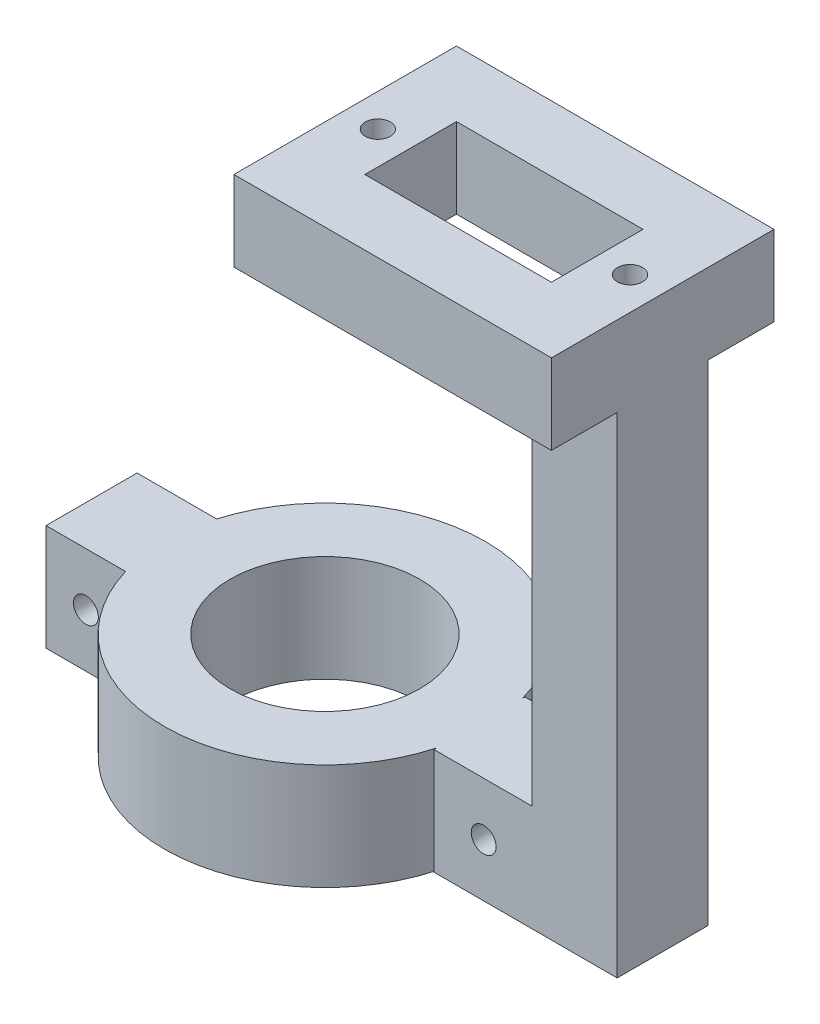
ISO-10303-21;
HEADER;
FILE_DESCRIPTION(('STEP AP214'),'2;1');
FILE_NAME('part.step','',(''),(''),'','','');
FILE_SCHEMA(('AUTOMOTIVE_DESIGN { 1 0 10303 214 1 1 1 1 }'));
ENDSEC;
DATA;
#1=APPLICATION_CONTEXT('core data for automotive mechanical design processes');
#2=APPLICATION_PROTOCOL_DEFINITION('international standard','automotive_design',2000,#1);
#3=PRODUCT_CONTEXT('',#1,'mechanical');
#4=PRODUCT('Part','Part','',(#3));
#5=PRODUCT_RELATED_PRODUCT_CATEGORY('part','',(#4));
#6=PRODUCT_DEFINITION_FORMATION('','',#4);
#7=PRODUCT_DEFINITION_CONTEXT('part definition',#1,'design');
#8=PRODUCT_DEFINITION('design','',#6,#7);
#9=PRODUCT_DEFINITION_SHAPE('','',#8);
#10=(LENGTH_UNIT() NAMED_UNIT(*) SI_UNIT(.MILLI.,.METRE.));
#11=(NAMED_UNIT(*) PLANE_ANGLE_UNIT() SI_UNIT($,.RADIAN.));
#12=(NAMED_UNIT(*) SI_UNIT($,.STERADIAN.) SOLID_ANGLE_UNIT());
#13=UNCERTAINTY_MEASURE_WITH_UNIT(LENGTH_MEASURE(1.E-05),#10,'distance_accuracy_value','');
#14=(GEOMETRIC_REPRESENTATION_CONTEXT(3) GLOBAL_UNCERTAINTY_ASSIGNED_CONTEXT((#13)) GLOBAL_UNIT_ASSIGNED_CONTEXT((#10,
#11,#12)) REPRESENTATION_CONTEXT('',''));
#15=CARTESIAN_POINT('',(0.,0.,0.));
#16=DIRECTION('',(0.,0.,1.));
#17=DIRECTION('',(1.,0.,0.));
#18=AXIS2_PLACEMENT_3D('',#15,#16,#17);
#19=CARTESIAN_POINT('',(-27.351479578733,-58.59,0.));
#20=DIRECTION('',(0.,-1.,0.));
#21=DIRECTION('',(0.,0.,-1.));
#22=AXIS2_PLACEMENT_3D('',#19,#20,#21);
#23=CYLINDRICAL_SURFACE('',#22,24.5);
#24=DIRECTION('',(0.,-1.,0.));
#25=VECTOR('',#24,1.);
#26=CARTESIAN_POINT('',(-50.8435628196889,-58.59,-6.95500000000001));
#27=LINE('',#26,#25);
#28=CARTESIAN_POINT('',(-50.8435628196889,-58.59,-6.95500000000001));
#29=VERTEX_POINT('',#28);
#30=CARTESIAN_POINT('',(-50.8435628196889,-74.82,-6.95500000000001));
#31=VERTEX_POINT('',#30);
#32=EDGE_CURVE('E12',#29,#31,#27,.T.);
#33=ORIENTED_EDGE('',*,*,#32,.F.);
#34=CARTESIAN_POINT('',(-27.351479578733,-58.59,0.));
#35=DIRECTION('',(0.,-1.,0.));
#36=DIRECTION('',(1.,0.,0.));
#37=AXIS2_PLACEMENT_3D('',#34,#35,#36);
#38=CIRCLE('',#37,24.5);
#39=CARTESIAN_POINT('',(-3.74499999999999,-58.59,-6.55622771865516));
#40=VERTEX_POINT('',#39);
#41=EDGE_CURVE('E216',#29,#40,#38,.T.);
#42=ORIENTED_EDGE('',*,*,#41,.T.);
#43=DIRECTION('',(0.,-1.,0.));
#44=VECTOR('',#43,1.);
#45=CARTESIAN_POINT('',(-3.745,-58.59,-6.55622771865516));
#46=LINE('',#45,#44);
#47=CARTESIAN_POINT('',(-3.74499999999999,-74.82,-6.55622771865516));
#48=VERTEX_POINT('',#47);
#49=EDGE_CURVE('E386',#48,#40,#46,.F.);
#50=ORIENTED_EDGE('',*,*,#49,.F.);
#51=CARTESIAN_POINT('',(-27.351479578733,-74.82,0.));
#52=DIRECTION('',(0.,-1.,0.));
#53=DIRECTION('',(1.,0.,0.));
#54=AXIS2_PLACEMENT_3D('',#51,#52,#53);
#55=CIRCLE('',#54,24.5);
#56=EDGE_CURVE('E81',#31,#48,#55,.T.);
#57=ORIENTED_EDGE('',*,*,#56,.F.);
#58=EDGE_LOOP('',(#33,#42,#50,#57));
#59=FACE_BOUND('',#58,.T.);
#60=ADVANCED_FACE('F65',(#59),#23,.T.);
#61=CARTESIAN_POINT('',(-3.745,0.,0.));
#62=DIRECTION('',(1.,0.,0.));
#63=DIRECTION('',(0.,0.,-1.));
#64=AXIS2_PLACEMENT_3D('',#61,#62,#63);
#65=PLANE('',#64);
#66=DIRECTION('',(0.,0.,-1.));
#67=VECTOR('',#66,1.);
#68=CARTESIAN_POINT('',(-3.74499999999999,-58.59,-6.95500000000001));
#69=LINE('',#68,#67);
#70=CARTESIAN_POINT('',(-3.745,-58.59,6.95499999999999));
#71=VERTEX_POINT('',#70);
#72=CARTESIAN_POINT('',(-3.745,-58.59,6.55622771865517));
#73=VERTEX_POINT('',#72);
#74=EDGE_CURVE('E272',#71,#73,#69,.T.);
#75=ORIENTED_EDGE('',*,*,#74,.T.);
#76=DIRECTION('',(0.,-1.,0.));
#77=VECTOR('',#76,1.);
#78=CARTESIAN_POINT('',(-3.745,-58.59,6.55622771865518));
#79=LINE('',#78,#77);
#80=CARTESIAN_POINT('',(-3.745,-74.82,6.55622771865518));
#81=VERTEX_POINT('',#80);
#82=EDGE_CURVE('E389',#73,#81,#79,.T.);
#83=ORIENTED_EDGE('',*,*,#82,.T.);
#84=DIRECTION('',(0.,0.,1.));
#85=VECTOR('',#84,1.);
#86=CARTESIAN_POINT('',(-3.74499999999999,-74.82,-6.95500000000001));
#87=LINE('',#86,#85);
#88=CARTESIAN_POINT('',(-3.745,-74.82,6.95499999999999));
#89=VERTEX_POINT('',#88);
#90=EDGE_CURVE('E265',#81,#89,#87,.T.);
#91=ORIENTED_EDGE('',*,*,#90,.T.);
#92=DIRECTION('',(0.,1.,0.));
#93=VECTOR('',#92,1.);
#94=CARTESIAN_POINT('',(-3.745,-74.82,6.95499999999999));
#95=LINE('',#94,#93);
#96=EDGE_CURVE('E269',#89,#71,#95,.T.);
#97=ORIENTED_EDGE('',*,*,#96,.T.);
#98=EDGE_LOOP('',(#75,#83,#91,#97));
#99=FACE_BOUND('',#98,.T.);
#100=ADVANCED_FACE('F401',(#99),#65,.F.);
#101=CARTESIAN_POINT('',(11.255,-74.82,6.955));
#102=DIRECTION('',(1.,0.,0.));
#103=DIRECTION('',(0.,0.,-1.));
#104=AXIS2_PLACEMENT_3D('',#101,#102,#103);
#105=PLANE('',#104);
#106=DIRECTION('',(0.,0.,-1.));
#107=VECTOR('',#106,1.);
#108=CARTESIAN_POINT('',(11.255,-58.59,-6.955));
#109=LINE('',#108,#107);
#110=CARTESIAN_POINT('',(11.255,-58.59,6.955));
#111=VERTEX_POINT('',#110);
#112=CARTESIAN_POINT('',(11.255,-58.59,-6.955));
#113=VERTEX_POINT('',#112);
#114=EDGE_CURVE('E259',#111,#113,#109,.T.);
#115=ORIENTED_EDGE('',*,*,#114,.F.);
#116=DIRECTION('',(0.,1.,0.));
#117=VECTOR('',#116,1.);
#118=CARTESIAN_POINT('',(11.255,-74.82,6.955));
#119=LINE('',#118,#117);
#120=CARTESIAN_POINT('',(11.255,0.,6.955));
#121=VERTEX_POINT('',#120);
#122=EDGE_CURVE('E306',#111,#121,#119,.T.);
#123=ORIENTED_EDGE('',*,*,#122,.T.);
#124=DIRECTION('',(0.,0.,-1.));
#125=VECTOR('',#124,1.);
#126=CARTESIAN_POINT('',(11.255,0.,6.955));
#127=LINE('',#126,#125);
#128=CARTESIAN_POINT('',(11.255,0.,-6.955));
#129=VERTEX_POINT('',#128);
#130=EDGE_CURVE('E296',#121,#129,#127,.T.);
#131=ORIENTED_EDGE('',*,*,#130,.T.);
#132=DIRECTION('',(0.,1.,0.));
#133=VECTOR('',#132,1.);
#134=CARTESIAN_POINT('',(11.255,-74.82,-6.955));
#135=LINE('',#134,#133);
#136=EDGE_CURVE('E304',#113,#129,#135,.T.);
#137=ORIENTED_EDGE('',*,*,#136,.F.);
#138=EDGE_LOOP('',(#115,#123,#131,#137));
#139=FACE_BOUND('',#138,.T.);
#140=ADVANCED_FACE('F442',(#139),#105,.F.);
#141=CARTESIAN_POINT('',(0.,0.,0.));
#142=DIRECTION('',(0.,1.,0.));
#143=DIRECTION('',(0.,0.,1.));
#144=AXIS2_PLACEMENT_3D('',#141,#142,#143);
#145=PLANE('',#144);
#146=CARTESIAN_POINT('',(-19.2550000000077,0.,0.));
#147=DIRECTION('',(0.,1.,0.));
#148=DIRECTION('',(0.,0.,1.));
#149=AXIS2_PLACEMENT_3D('',#146,#147,#148);
#150=CIRCLE('',#149,1.91);
#151=CARTESIAN_POINT('',(-19.2550000000077,0.,1.91));
#152=VERTEX_POINT('',#151);
#153=EDGE_CURVE('E318',#152,#152,#150,.T.);
#154=ORIENTED_EDGE('',*,*,#153,.T.);
#155=EDGE_LOOP('',(#154));
#156=FACE_BOUND('',#155,.T.);
#157=DIRECTION('',(1.,0.,0.));
#158=VECTOR('',#157,1.);
#159=CARTESIAN_POINT('',(11.255,0.,-6.955));
#160=LINE('',#159,#158);
#161=CARTESIAN_POINT('',(14.255,0.,-6.955));
#162=VERTEX_POINT('',#161);
#163=CARTESIAN_POINT('',(24.255,0.,-6.955));
#164=VERTEX_POINT('',#163);
#165=EDGE_CURVE('E301',#162,#164,#160,.T.);
#166=ORIENTED_EDGE('',*,*,#165,.F.);
#167=DIRECTION('',(0.,0.,-1.));
#168=VECTOR('',#167,1.);
#169=CARTESIAN_POINT('',(14.255,0.,-7.));
#170=LINE('',#169,#168);
#171=CARTESIAN_POINT('',(14.255,0.,-7.));
#172=VERTEX_POINT('',#171);
#173=EDGE_CURVE('E321',#162,#172,#170,.T.);
#174=ORIENTED_EDGE('',*,*,#173,.T.);
#175=DIRECTION('',(-1.,0.,0.));
#176=VECTOR('',#175,1.);
#177=CARTESIAN_POINT('',(-14.255,0.,-7.));
#178=LINE('',#177,#176);
#179=CARTESIAN_POINT('',(-14.255,0.,-7.));
#180=VERTEX_POINT('',#179);
#181=EDGE_CURVE('E337',#172,#180,#178,.T.);
#182=ORIENTED_EDGE('',*,*,#181,.T.);
#183=DIRECTION('',(0.,0.,1.));
#184=VECTOR('',#183,1.);
#185=CARTESIAN_POINT('',(-14.255,0.,-7.));
#186=LINE('',#185,#184);
#187=CARTESIAN_POINT('',(-14.255,0.,7.));
#188=VERTEX_POINT('',#187);
#189=EDGE_CURVE('E341',#180,#188,#186,.T.);
#190=ORIENTED_EDGE('',*,*,#189,.T.);
#191=DIRECTION('',(1.,0.,0.));
#192=VECTOR('',#191,1.);
#193=CARTESIAN_POINT('',(-14.255,0.,7.));
#194=LINE('',#193,#192);
#195=CARTESIAN_POINT('',(14.255,0.,7.));
#196=VERTEX_POINT('',#195);
#197=EDGE_CURVE('E327',#188,#196,#194,.T.);
#198=ORIENTED_EDGE('',*,*,#197,.T.);
#199=CARTESIAN_POINT('',(14.255,0.,6.955));
#200=VERTEX_POINT('',#199);
#201=EDGE_CURVE('E335',#196,#200,#170,.T.);
#202=ORIENTED_EDGE('',*,*,#201,.T.);
#203=DIRECTION('',(-1.,0.,0.));
#204=VECTOR('',#203,1.);
#205=CARTESIAN_POINT('',(11.255,0.,6.955));
#206=LINE('',#205,#204);
#207=CARTESIAN_POINT('',(24.255,0.,6.955));
#208=VERTEX_POINT('',#207);
#209=EDGE_CURVE('E293',#208,#200,#206,.T.);
#210=ORIENTED_EDGE('',*,*,#209,.F.);
#211=DIRECTION('',(0.,0.,-1.));
#212=VECTOR('',#211,1.);
#213=CARTESIAN_POINT('',(24.255,0.,-7.));
#214=LINE('',#213,#212);
#215=CARTESIAN_POINT('',(24.255,0.,17.));
#216=VERTEX_POINT('',#215);
#217=EDGE_CURVE('E367',#216,#208,#214,.T.);
#218=ORIENTED_EDGE('',*,*,#217,.F.);
#219=DIRECTION('',(1.,0.,0.));
#220=VECTOR('',#219,1.);
#221=CARTESIAN_POINT('',(-14.255,0.,17.));
#222=LINE('',#221,#220);
#223=CARTESIAN_POINT('',(-24.255,0.,17.));
#224=VERTEX_POINT('',#223);
#225=EDGE_CURVE('E360',#224,#216,#222,.T.);
#226=ORIENTED_EDGE('',*,*,#225,.F.);
#227=DIRECTION('',(0.,0.,1.));
#228=VECTOR('',#227,1.);
#229=CARTESIAN_POINT('',(-24.255,0.,-7.));
#230=LINE('',#229,#228);
#231=CARTESIAN_POINT('',(-24.255,0.,-17.));
#232=VERTEX_POINT('',#231);
#233=EDGE_CURVE('E372',#232,#224,#230,.T.);
#234=ORIENTED_EDGE('',*,*,#233,.F.);
#235=DIRECTION('',(-1.,0.,0.));
#236=VECTOR('',#235,1.);
#237=CARTESIAN_POINT('',(-14.255,0.,-17.));
#238=LINE('',#237,#236);
#239=CARTESIAN_POINT('',(24.255,0.,-17.));
#240=VERTEX_POINT('',#239);
#241=EDGE_CURVE('E370',#240,#232,#238,.T.);
#242=ORIENTED_EDGE('',*,*,#241,.F.);
#243=EDGE_CURVE('E355',#164,#240,#214,.T.);
#244=ORIENTED_EDGE('',*,*,#243,.F.);
#245=EDGE_LOOP('',(#166,#174,#182,#190,#198,#202,#210,#218,#226,#234,#242,#244));
#246=FACE_BOUND('',#245,.T.);
#247=ADVANCED_FACE('F428',(#156,#246),#145,.F.);
#248=CARTESIAN_POINT('',(0.,12.25,0.));
#249=DIRECTION('',(0.,1.,0.));
#250=DIRECTION('',(0.,0.,1.));
#251=AXIS2_PLACEMENT_3D('',#248,#249,#250);
#252=PLANE('',#251);
#253=CARTESIAN_POINT('',(19.2549999999935,12.25,0.));
#254=DIRECTION('',(0.,1.,0.));
#255=DIRECTION('',(0.,0.,1.));
#256=AXIS2_PLACEMENT_3D('',#253,#254,#255);
#257=CIRCLE('',#256,1.91);
#258=CARTESIAN_POINT('',(19.2549999999935,12.25,1.91));
#259=VERTEX_POINT('',#258);
#260=EDGE_CURVE('E311',#259,#259,#257,.T.);
#261=ORIENTED_EDGE('',*,*,#260,.F.);
#262=EDGE_LOOP('',(#261));
#263=FACE_BOUND('',#262,.T.);
#264=CARTESIAN_POINT('',(-19.2550000000077,12.25,0.));
#265=DIRECTION('',(0.,1.,0.));
#266=DIRECTION('',(0.,0.,1.));
#267=AXIS2_PLACEMENT_3D('',#264,#265,#266);
#268=CIRCLE('',#267,1.91);
#269=CARTESIAN_POINT('',(-19.2550000000077,12.25,1.91));
#270=VERTEX_POINT('',#269);
#271=EDGE_CURVE('E315',#270,#270,#268,.T.);
#272=ORIENTED_EDGE('',*,*,#271,.F.);
#273=EDGE_LOOP('',(#272));
#274=FACE_BOUND('',#273,.T.);
#275=DIRECTION('',(0.,0.,-1.));
#276=VECTOR('',#275,1.);
#277=CARTESIAN_POINT('',(24.255,12.25,-7.));
#278=LINE('',#277,#276);
#279=CARTESIAN_POINT('',(24.255,12.25,17.));
#280=VERTEX_POINT('',#279);
#281=CARTESIAN_POINT('',(24.255,12.25,-17.));
#282=VERTEX_POINT('',#281);
#283=EDGE_CURVE('E356',#280,#282,#278,.T.);
#284=ORIENTED_EDGE('',*,*,#283,.T.);
#285=DIRECTION('',(-1.,0.,0.));
#286=VECTOR('',#285,1.);
#287=CARTESIAN_POINT('',(-14.255,12.25,-17.));
#288=LINE('',#287,#286);
#289=CARTESIAN_POINT('',(-24.255,12.25,-17.));
#290=VERTEX_POINT('',#289);
#291=EDGE_CURVE('E359',#282,#290,#288,.T.);
#292=ORIENTED_EDGE('',*,*,#291,.T.);
#293=DIRECTION('',(0.,0.,1.));
#294=VECTOR('',#293,1.);
#295=CARTESIAN_POINT('',(-24.255,12.25,-7.));
#296=LINE('',#295,#294);
#297=CARTESIAN_POINT('',(-24.255,12.25,17.));
#298=VERTEX_POINT('',#297);
#299=EDGE_CURVE('E362',#290,#298,#296,.T.);
#300=ORIENTED_EDGE('',*,*,#299,.T.);
#301=DIRECTION('',(1.,0.,0.));
#302=VECTOR('',#301,1.);
#303=CARTESIAN_POINT('',(-14.255,12.25,17.));
#304=LINE('',#303,#302);
#305=EDGE_CURVE('E364',#298,#280,#304,.T.);
#306=ORIENTED_EDGE('',*,*,#305,.T.);
#307=EDGE_LOOP('',(#284,#292,#300,#306));
#308=FACE_BOUND('',#307,.T.);
#309=DIRECTION('',(-1.,0.,0.));
#310=VECTOR('',#309,1.);
#311=CARTESIAN_POINT('',(-14.255,12.25,-7.));
#312=LINE('',#311,#310);
#313=CARTESIAN_POINT('',(14.255,12.25,-7.));
#314=VERTEX_POINT('',#313);
#315=CARTESIAN_POINT('',(-14.255,12.25,-7.));
#316=VERTEX_POINT('',#315);
#317=EDGE_CURVE('E326',#314,#316,#312,.T.);
#318=ORIENTED_EDGE('',*,*,#317,.F.);
#319=DIRECTION('',(0.,0.,-1.));
#320=VECTOR('',#319,1.);
#321=CARTESIAN_POINT('',(14.255,12.25,-7.));
#322=LINE('',#321,#320);
#323=CARTESIAN_POINT('',(14.255,12.25,7.));
#324=VERTEX_POINT('',#323);
#325=EDGE_CURVE('E324',#324,#314,#322,.T.);
#326=ORIENTED_EDGE('',*,*,#325,.F.);
#327=DIRECTION('',(1.,0.,0.));
#328=VECTOR('',#327,1.);
#329=CARTESIAN_POINT('',(-14.255,12.25,7.));
#330=LINE('',#329,#328);
#331=CARTESIAN_POINT('',(-14.255,12.25,7.));
#332=VERTEX_POINT('',#331);
#333=EDGE_CURVE('E332',#332,#324,#330,.T.);
#334=ORIENTED_EDGE('',*,*,#333,.F.);
#335=DIRECTION('',(0.,0.,1.));
#336=VECTOR('',#335,1.);
#337=CARTESIAN_POINT('',(-14.255,12.25,-7.));
#338=LINE('',#337,#336);
#339=EDGE_CURVE('E329',#316,#332,#338,.T.);
#340=ORIENTED_EDGE('',*,*,#339,.F.);
#341=EDGE_LOOP('',(#318,#326,#334,#340));
#342=FACE_BOUND('',#341,.T.);
#343=ADVANCED_FACE('F449',(#263,#274,#308,#342),#252,.T.);
#344=CARTESIAN_POINT('',(24.255,12.25,-7.));
#345=DIRECTION('',(-1.,0.,0.));
#346=DIRECTION('',(0.,0.,1.));
#347=AXIS2_PLACEMENT_3D('',#344,#345,#346);
#348=PLANE('',#347);
#349=ORIENTED_EDGE('',*,*,#217,.T.);
#350=DIRECTION('',(0.,1.,0.));
#351=VECTOR('',#350,1.);
#352=CARTESIAN_POINT('',(24.255,-74.82,6.955));
#353=LINE('',#352,#351);
#354=CARTESIAN_POINT('',(24.255,-74.82,6.955));
#355=VERTEX_POINT('',#354);
#356=EDGE_CURVE('E308',#355,#208,#353,.T.);
#357=ORIENTED_EDGE('',*,*,#356,.F.);
#358=DIRECTION('',(0.,0.,1.));
#359=VECTOR('',#358,1.);
#360=CARTESIAN_POINT('',(24.255,-74.82,6.955));
#361=LINE('',#360,#359);
#362=CARTESIAN_POINT('',(24.255,-74.82,-6.955));
#363=VERTEX_POINT('',#362);
#364=EDGE_CURVE('E283',#363,#355,#361,.T.);
#365=ORIENTED_EDGE('',*,*,#364,.F.);
#366=DIRECTION('',(0.,1.,0.));
#367=VECTOR('',#366,1.);
#368=CARTESIAN_POINT('',(24.255,-74.82,-6.955));
#369=LINE('',#368,#367);
#370=EDGE_CURVE('E292',#363,#164,#369,.T.);
#371=ORIENTED_EDGE('',*,*,#370,.T.);
#372=ORIENTED_EDGE('',*,*,#243,.T.);
#373=DIRECTION('',(0.,-1.,0.));
#374=VECTOR('',#373,1.);
#375=CARTESIAN_POINT('',(24.255,12.25,-17.));
#376=LINE('',#375,#374);
#377=EDGE_CURVE('E383',#282,#240,#376,.T.);
#378=ORIENTED_EDGE('',*,*,#377,.F.);
#379=ORIENTED_EDGE('',*,*,#283,.F.);
#380=DIRECTION('',(0.,-1.,0.));
#381=VECTOR('',#380,1.);
#382=CARTESIAN_POINT('',(24.255,12.25,17.));
#383=LINE('',#382,#381);
#384=EDGE_CURVE('E366',#280,#216,#383,.T.);
#385=ORIENTED_EDGE('',*,*,#384,.T.);
#386=EDGE_LOOP('',(#349,#357,#365,#371,#372,#378,#379,#385));
#387=FACE_BOUND('',#386,.T.);
#388=ADVANCED_FACE('F67',(#387),#348,.F.);
#389=CARTESIAN_POINT('',(-14.255,12.25,-17.));
#390=DIRECTION('',(0.,0.,1.));
#391=DIRECTION('',(1.,0.,0.));
#392=AXIS2_PLACEMENT_3D('',#389,#390,#391);
#393=PLANE('',#392);
#394=ORIENTED_EDGE('',*,*,#241,.T.);
#395=DIRECTION('',(0.,-1.,0.));
#396=VECTOR('',#395,1.);
#397=CARTESIAN_POINT('',(-24.255,12.25,-17.));
#398=LINE('',#397,#396);
#399=EDGE_CURVE('E380',#290,#232,#398,.T.);
#400=ORIENTED_EDGE('',*,*,#399,.F.);
#401=ORIENTED_EDGE('',*,*,#291,.F.);
#402=ORIENTED_EDGE('',*,*,#377,.T.);
#403=EDGE_LOOP('',(#394,#400,#401,#402));
#404=FACE_BOUND('',#403,.T.);
#405=ADVANCED_FACE('F630',(#404),#393,.F.);
#406=CARTESIAN_POINT('',(-24.255,12.25,-7.));
#407=DIRECTION('',(1.,0.,0.));
#408=DIRECTION('',(0.,0.,-1.));
#409=AXIS2_PLACEMENT_3D('',#406,#407,#408);
#410=PLANE('',#409);
#411=ORIENTED_EDGE('',*,*,#233,.T.);
#412=DIRECTION('',(0.,-1.,0.));
#413=VECTOR('',#412,1.);
#414=CARTESIAN_POINT('',(-24.255,12.25,17.));
#415=LINE('',#414,#413);
#416=EDGE_CURVE('E377',#298,#224,#415,.T.);
#417=ORIENTED_EDGE('',*,*,#416,.F.);
#418=ORIENTED_EDGE('',*,*,#299,.F.);
#419=ORIENTED_EDGE('',*,*,#399,.T.);
#420=EDGE_LOOP('',(#411,#417,#418,#419));
#421=FACE_BOUND('',#420,.T.);
#422=ADVANCED_FACE('F697',(#421),#410,.F.);
#423=CARTESIAN_POINT('',(-14.255,12.25,17.));
#424=DIRECTION('',(0.,0.,-1.));
#425=DIRECTION('',(-1.,0.,0.));
#426=AXIS2_PLACEMENT_3D('',#423,#424,#425);
#427=PLANE('',#426);
#428=ORIENTED_EDGE('',*,*,#225,.T.);
#429=ORIENTED_EDGE('',*,*,#384,.F.);
#430=ORIENTED_EDGE('',*,*,#305,.F.);
#431=ORIENTED_EDGE('',*,*,#416,.T.);
#432=EDGE_LOOP('',(#428,#429,#430,#431));
#433=FACE_BOUND('',#432,.T.);
#434=ADVANCED_FACE('F690',(#433),#427,.F.);
#435=CARTESIAN_POINT('',(14.255,12.25,-7.));
#436=DIRECTION('',(-1.,0.,0.));
#437=DIRECTION('',(0.,0.,1.));
#438=AXIS2_PLACEMENT_3D('',#435,#436,#437);
#439=PLANE('',#438);
#440=ORIENTED_EDGE('',*,*,#201,.F.);
#441=DIRECTION('',(0.,-1.,0.));
#442=VECTOR('',#441,1.);
#443=CARTESIAN_POINT('',(14.255,12.25,7.));
#444=LINE('',#443,#442);
#445=EDGE_CURVE('E334',#324,#196,#444,.T.);
#446=ORIENTED_EDGE('',*,*,#445,.F.);
#447=ORIENTED_EDGE('',*,*,#325,.T.);
#448=DIRECTION('',(0.,-1.,0.));
#449=VECTOR('',#448,1.);
#450=CARTESIAN_POINT('',(14.255,12.25,-7.));
#451=LINE('',#450,#449);
#452=EDGE_CURVE('E352',#314,#172,#451,.T.);
#453=ORIENTED_EDGE('',*,*,#452,.T.);
#454=ORIENTED_EDGE('',*,*,#173,.F.);
#455=EDGE_CURVE('E338',#200,#162,#170,.T.);
#456=ORIENTED_EDGE('',*,*,#455,.F.);
#457=EDGE_LOOP('',(#440,#446,#447,#453,#454,#456));
#458=FACE_BOUND('',#457,.T.);
#459=ADVANCED_FACE('F437',(#458),#439,.T.);
#460=CARTESIAN_POINT('',(-14.255,12.25,-7.));
#461=DIRECTION('',(0.,0.,1.));
#462=DIRECTION('',(1.,0.,0.));
#463=AXIS2_PLACEMENT_3D('',#460,#461,#462);
#464=PLANE('',#463);
#465=ORIENTED_EDGE('',*,*,#181,.F.);
#466=ORIENTED_EDGE('',*,*,#452,.F.);
#467=ORIENTED_EDGE('',*,*,#317,.T.);
#468=DIRECTION('',(0.,-1.,0.));
#469=VECTOR('',#468,1.);
#470=CARTESIAN_POINT('',(-14.255,12.25,-7.));
#471=LINE('',#470,#469);
#472=EDGE_CURVE('E350',#316,#180,#471,.T.);
#473=ORIENTED_EDGE('',*,*,#472,.T.);
#474=EDGE_LOOP('',(#465,#466,#467,#473));
#475=FACE_BOUND('',#474,.T.);
#476=ADVANCED_FACE('F673',(#475),#464,.T.);
#477=CARTESIAN_POINT('',(-14.255,12.25,-7.));
#478=DIRECTION('',(1.,0.,0.));
#479=DIRECTION('',(0.,0.,-1.));
#480=AXIS2_PLACEMENT_3D('',#477,#478,#479);
#481=PLANE('',#480);
#482=ORIENTED_EDGE('',*,*,#189,.F.);
#483=ORIENTED_EDGE('',*,*,#472,.F.);
#484=ORIENTED_EDGE('',*,*,#339,.T.);
#485=DIRECTION('',(0.,-1.,0.));
#486=VECTOR('',#485,1.);
#487=CARTESIAN_POINT('',(-14.255,12.25,7.));
#488=LINE('',#487,#486);
#489=EDGE_CURVE('E348',#332,#188,#488,.T.);
#490=ORIENTED_EDGE('',*,*,#489,.T.);
#491=EDGE_LOOP('',(#482,#483,#484,#490));
#492=FACE_BOUND('',#491,.T.);
#493=ADVANCED_FACE('F664',(#492),#481,.T.);
#494=CARTESIAN_POINT('',(-14.255,12.25,7.));
#495=DIRECTION('',(0.,0.,-1.));
#496=DIRECTION('',(-1.,0.,0.));
#497=AXIS2_PLACEMENT_3D('',#494,#495,#496);
#498=PLANE('',#497);
#499=ORIENTED_EDGE('',*,*,#197,.F.);
#500=ORIENTED_EDGE('',*,*,#489,.F.);
#501=ORIENTED_EDGE('',*,*,#333,.T.);
#502=ORIENTED_EDGE('',*,*,#445,.T.);
#503=EDGE_LOOP('',(#499,#500,#501,#502));
#504=FACE_BOUND('',#503,.T.);
#505=ADVANCED_FACE('F654',(#504),#498,.T.);
#506=CARTESIAN_POINT('',(-19.2550000000077,0.,0.));
#507=DIRECTION('',(0.,1.,0.));
#508=DIRECTION('',(0.,0.,1.));
#509=AXIS2_PLACEMENT_3D('',#506,#507,#508);
#510=CYLINDRICAL_SURFACE('',#509,1.91);
#511=ORIENTED_EDGE('',*,*,#153,.F.);
#512=EDGE_LOOP('',(#511));
#513=FACE_BOUND('',#512,.T.);
#514=ORIENTED_EDGE('',*,*,#271,.T.);
#515=EDGE_LOOP('',(#514));
#516=FACE_BOUND('',#515,.T.);
#517=ADVANCED_FACE('F645',(#513,#516),#510,.F.);
#518=CARTESIAN_POINT('',(19.2549999999935,0.,0.));
#519=DIRECTION('',(0.,1.,0.));
#520=DIRECTION('',(0.,0.,1.));
#521=AXIS2_PLACEMENT_3D('',#518,#519,#520);
#522=CYLINDRICAL_SURFACE('',#521,1.91);
#523=CARTESIAN_POINT('',(19.2549999999935,0.,0.));
#524=DIRECTION('',(0.,1.,0.));
#525=DIRECTION('',(0.,0.,1.));
#526=AXIS2_PLACEMENT_3D('',#523,#524,#525);
#527=CIRCLE('',#526,1.91);
#528=CARTESIAN_POINT('',(19.2549999999935,0.,1.91));
#529=VERTEX_POINT('',#528);
#530=EDGE_CURVE('E312',#529,#529,#527,.T.);
#531=ORIENTED_EDGE('',*,*,#530,.F.);
#532=EDGE_LOOP('',(#531));
#533=FACE_BOUND('',#532,.T.);
#534=ORIENTED_EDGE('',*,*,#260,.T.);
#535=EDGE_LOOP('',(#534));
#536=FACE_BOUND('',#535,.T.);
#537=ADVANCED_FACE('F481',(#533,#536),#522,.F.);
#538=CARTESIAN_POINT('',(0.,-74.82,0.));
#539=DIRECTION('',(0.,-1.,0.));
#540=DIRECTION('',(0.,0.,-1.));
#541=AXIS2_PLACEMENT_3D('',#538,#539,#540);
#542=PLANE('',#541);
#543=CARTESIAN_POINT('',(-50.8435628196889,-74.82,6.955));
#544=VERTEX_POINT('',#543);
#545=EDGE_CURVE('E260',#81,#544,#55,.T.);
#546=ORIENTED_EDGE('',*,*,#545,.T.);
#547=DIRECTION('',(1.,0.,0.));
#548=VECTOR('',#547,1.);
#549=CARTESIAN_POINT('',(-63.,-74.82,6.95499999999999));
#550=LINE('',#549,#548);
#551=CARTESIAN_POINT('',(-63.,-74.82,6.95499999999999));
#552=VERTEX_POINT('',#551);
#553=EDGE_CURVE('E244',#552,#544,#550,.T.);
#554=ORIENTED_EDGE('',*,*,#553,.F.);
#555=DIRECTION('',(0.,0.,-1.));
#556=VECTOR('',#555,1.);
#557=CARTESIAN_POINT('',(-63.,-74.82,-6.95500000000001));
#558=LINE('',#557,#556);
#559=CARTESIAN_POINT('',(-63.,-74.82,-6.95500000000001));
#560=VERTEX_POINT('',#559);
#561=EDGE_CURVE('E220',#552,#560,#558,.T.);
#562=ORIENTED_EDGE('',*,*,#561,.T.);
#563=DIRECTION('',(1.,0.,0.));
#564=VECTOR('',#563,1.);
#565=CARTESIAN_POINT('',(-63.,-74.82,-6.95500000000001));
#566=LINE('',#565,#564);
#567=EDGE_CURVE('E234',#560,#31,#566,.T.);
#568=ORIENTED_EDGE('',*,*,#567,.T.);
#569=ORIENTED_EDGE('',*,*,#56,.T.);
#570=CARTESIAN_POINT('',(-3.74499999999999,-74.82,-6.95500000000001));
#571=VERTEX_POINT('',#570);
#572=EDGE_CURVE('E266',#571,#48,#87,.T.);
#573=ORIENTED_EDGE('',*,*,#572,.F.);
#574=DIRECTION('',(1.,0.,0.));
#575=VECTOR('',#574,1.);
#576=CARTESIAN_POINT('',(11.255,-74.82,-6.955));
#577=LINE('',#576,#575);
#578=EDGE_CURVE('E290',#571,#363,#577,.T.);
#579=ORIENTED_EDGE('',*,*,#578,.T.);
#580=ORIENTED_EDGE('',*,*,#364,.T.);
#581=DIRECTION('',(-1.,0.,0.));
#582=VECTOR('',#581,1.);
#583=CARTESIAN_POINT('',(11.255,-74.82,6.955));
#584=LINE('',#583,#582);
#585=EDGE_CURVE('E286',#355,#89,#584,.T.);
#586=ORIENTED_EDGE('',*,*,#585,.T.);
#587=ORIENTED_EDGE('',*,*,#90,.F.);
#588=EDGE_LOOP('',(#546,#554,#562,#568,#569,#573,#579,#580,#586,#587));
#589=FACE_BOUND('',#588,.T.);
#590=CARTESIAN_POINT('',(-27.351479578733,-74.82,0.));
#591=DIRECTION('',(0.,-1.,0.));
#592=DIRECTION('',(0.,0.,-1.));
#593=AXIS2_PLACEMENT_3D('',#590,#591,#592);
#594=CIRCLE('',#593,14.5);
#595=CARTESIAN_POINT('',(-27.351479578733,-74.82,-14.5));
#596=VERTEX_POINT('',#595);
#597=EDGE_CURVE('E254',#596,#596,#594,.T.);
#598=ORIENTED_EDGE('',*,*,#597,.F.);
#599=EDGE_LOOP('',(#598));
#600=FACE_BOUND('',#599,.T.);
#601=ADVANCED_FACE('F418',(#589,#600),#542,.T.);
#602=CARTESIAN_POINT('',(11.255,-74.82,-6.955));
#603=DIRECTION('',(0.,0.,1.));
#604=DIRECTION('',(1.,0.,0.));
#605=AXIS2_PLACEMENT_3D('',#602,#603,#604);
#606=PLANE('',#605);
#607=CARTESIAN_POINT('',(3.85671364878704,-66.705,-6.955));
#608=DIRECTION('',(0.,0.,-1.));
#609=DIRECTION('',(-1.,0.,0.));
#610=AXIS2_PLACEMENT_3D('',#607,#608,#609);
#611=CIRCLE('',#610,1.9);
#612=CARTESIAN_POINT('',(1.95671364878704,-66.705,-6.955));
#613=VERTEX_POINT('',#612);
#614=EDGE_CURVE('E243',#613,#613,#611,.T.);
#615=ORIENTED_EDGE('',*,*,#614,.F.);
#616=EDGE_LOOP('',(#615));
#617=FACE_BOUND('',#616,.T.);
#618=EDGE_CURVE('E287',#129,#162,#160,.T.);
#619=ORIENTED_EDGE('',*,*,#618,.T.);
#620=ORIENTED_EDGE('',*,*,#165,.T.);
#621=ORIENTED_EDGE('',*,*,#370,.F.);
#622=ORIENTED_EDGE('',*,*,#578,.F.);
#623=DIRECTION('',(0.,-1.,0.));
#624=VECTOR('',#623,1.);
#625=CARTESIAN_POINT('',(-3.74499999999999,-74.82,-6.95500000000001));
#626=LINE('',#625,#624);
#627=CARTESIAN_POINT('',(-3.74499999999999,-58.59,-6.95500000000001));
#628=VERTEX_POINT('',#627);
#629=EDGE_CURVE('E262',#628,#571,#626,.T.);
#630=ORIENTED_EDGE('',*,*,#629,.F.);
#631=DIRECTION('',(1.,0.,0.));
#632=VECTOR('',#631,1.);
#633=CARTESIAN_POINT('',(-3.74499999999999,-58.59,-6.95500000000001));
#634=LINE('',#633,#632);
#635=EDGE_CURVE('E274',#628,#113,#634,.T.);
#636=ORIENTED_EDGE('',*,*,#635,.T.);
#637=ORIENTED_EDGE('',*,*,#136,.T.);
#638=EDGE_LOOP('',(#619,#620,#621,#622,#630,#636,#637));
#639=FACE_BOUND('',#638,.T.);
#640=ADVANCED_FACE('F412',(#617,#639),#606,.F.);
#641=CARTESIAN_POINT('',(11.255,-74.82,6.955));
#642=DIRECTION('',(0.,0.,-1.));
#643=DIRECTION('',(-1.,0.,0.));
#644=AXIS2_PLACEMENT_3D('',#641,#642,#643);
#645=PLANE('',#644);
#646=CARTESIAN_POINT('',(3.85671364878704,-66.705,6.955));
#647=DIRECTION('',(0.,0.,-1.));
#648=DIRECTION('',(-1.,0.,0.));
#649=AXIS2_PLACEMENT_3D('',#646,#647,#648);
#650=CIRCLE('',#649,1.9);
#651=CARTESIAN_POINT('',(1.95671364878704,-66.705,6.955));
#652=VERTEX_POINT('',#651);
#653=EDGE_CURVE('E250',#652,#652,#650,.T.);
#654=ORIENTED_EDGE('',*,*,#653,.T.);
#655=EDGE_LOOP('',(#654));
#656=FACE_BOUND('',#655,.T.);
#657=ORIENTED_EDGE('',*,*,#209,.T.);
#658=EDGE_CURVE('E282',#200,#121,#206,.T.);
#659=ORIENTED_EDGE('',*,*,#658,.T.);
#660=ORIENTED_EDGE('',*,*,#122,.F.);
#661=DIRECTION('',(1.,0.,0.));
#662=VECTOR('',#661,1.);
#663=CARTESIAN_POINT('',(-3.745,-58.59,6.95499999999999));
#664=LINE('',#663,#662);
#665=EDGE_CURVE('E279',#71,#111,#664,.T.);
#666=ORIENTED_EDGE('',*,*,#665,.F.);
#667=ORIENTED_EDGE('',*,*,#96,.F.);
#668=ORIENTED_EDGE('',*,*,#585,.F.);
#669=ORIENTED_EDGE('',*,*,#356,.T.);
#670=EDGE_LOOP('',(#657,#659,#660,#666,#667,#668,#669));
#671=FACE_BOUND('',#670,.T.);
#672=ADVANCED_FACE('F406',(#656,#671),#645,.F.);
#673=CARTESIAN_POINT('',(0.,0.,0.));
#674=DIRECTION('',(0.,-1.,0.));
#675=DIRECTION('',(0.,0.,-1.));
#676=AXIS2_PLACEMENT_3D('',#673,#674,#675);
#677=PLANE('',#676);
#678=ORIENTED_EDGE('',*,*,#658,.F.);
#679=ORIENTED_EDGE('',*,*,#455,.T.);
#680=ORIENTED_EDGE('',*,*,#618,.F.);
#681=ORIENTED_EDGE('',*,*,#130,.F.);
#682=EDGE_LOOP('',(#678,#679,#680,#681));
#683=FACE_BOUND('',#682,.T.);
#684=ADVANCED_FACE('F441',(#683),#677,.F.);
#685=ORIENTED_EDGE('',*,*,#530,.T.);
#686=EDGE_LOOP('',(#685));
#687=FACE_BOUND('',#686,.T.);
#688=ADVANCED_FACE('F476',(#687),#677,.F.);
#689=CARTESIAN_POINT('',(-3.74499999999999,-58.59,-6.95500000000001));
#690=DIRECTION('',(0.,-1.,0.));
#691=DIRECTION('',(0.,0.,-1.));
#692=AXIS2_PLACEMENT_3D('',#689,#690,#691);
#693=PLANE('',#692);
#694=DIRECTION('',(1.,0.,0.));
#695=VECTOR('',#694,1.);
#696=CARTESIAN_POINT('',(-63.,-58.59,6.95499999999999));
#697=LINE('',#696,#695);
#698=CARTESIAN_POINT('',(-63.,-58.59,6.95499999999999));
#699=VERTEX_POINT('',#698);
#700=CARTESIAN_POINT('',(-50.8435628196889,-58.59,6.95499999999999));
#701=VERTEX_POINT('',#700);
#702=EDGE_CURVE('E219',#699,#701,#697,.T.);
#703=ORIENTED_EDGE('',*,*,#702,.T.);
#704=EDGE_CURVE('E257',#73,#701,#38,.T.);
#705=ORIENTED_EDGE('',*,*,#704,.F.);
#706=ORIENTED_EDGE('',*,*,#74,.F.);
#707=ORIENTED_EDGE('',*,*,#665,.T.);
#708=ORIENTED_EDGE('',*,*,#114,.T.);
#709=ORIENTED_EDGE('',*,*,#635,.F.);
#710=EDGE_CURVE('E271',#40,#628,#69,.T.);
#711=ORIENTED_EDGE('',*,*,#710,.F.);
#712=ORIENTED_EDGE('',*,*,#41,.F.);
#713=DIRECTION('',(1.,0.,0.));
#714=VECTOR('',#713,1.);
#715=CARTESIAN_POINT('',(-63.,-58.59,-6.95500000000001));
#716=LINE('',#715,#714);
#717=CARTESIAN_POINT('',(-63.,-58.59,-6.95500000000001));
#718=VERTEX_POINT('',#717);
#719=EDGE_CURVE('E209',#718,#29,#716,.T.);
#720=ORIENTED_EDGE('',*,*,#719,.F.);
#721=DIRECTION('',(0.,0.,1.));
#722=VECTOR('',#721,1.);
#723=CARTESIAN_POINT('',(-63.,-58.59,-6.95500000000001));
#724=LINE('',#723,#722);
#725=EDGE_CURVE('E214',#718,#699,#724,.T.);
#726=ORIENTED_EDGE('',*,*,#725,.T.);
#727=EDGE_LOOP('',(#703,#705,#706,#707,#708,#709,#711,#712,#720,#726));
#728=FACE_BOUND('',#727,.T.);
#729=CARTESIAN_POINT('',(-27.351479578733,-58.59,0.));
#730=DIRECTION('',(0.,-1.,0.));
#731=DIRECTION('',(0.,0.,-1.));
#732=AXIS2_PLACEMENT_3D('',#729,#730,#731);
#733=CIRCLE('',#732,14.5);
#734=CARTESIAN_POINT('',(-27.351479578733,-58.59,-14.5));
#735=VERTEX_POINT('',#734);
#736=EDGE_CURVE('E251',#735,#735,#733,.T.);
#737=ORIENTED_EDGE('',*,*,#736,.T.);
#738=EDGE_LOOP('',(#737));
#739=FACE_BOUND('',#738,.T.);
#740=ADVANCED_FACE('F212',(#728,#739),#693,.F.);
#741=ORIENTED_EDGE('',*,*,#572,.T.);
#742=ORIENTED_EDGE('',*,*,#49,.T.);
#743=ORIENTED_EDGE('',*,*,#710,.T.);
#744=ORIENTED_EDGE('',*,*,#629,.T.);
#745=EDGE_LOOP('',(#741,#742,#743,#744));
#746=FACE_BOUND('',#745,.T.);
#747=ADVANCED_FACE('F416',(#746),#65,.F.);
#748=DIRECTION('',(0.,-1.,0.));
#749=VECTOR('',#748,1.);
#750=CARTESIAN_POINT('',(-50.8435628196889,-58.59,6.95499999999999));
#751=LINE('',#750,#749);
#752=EDGE_CURVE('E74',#544,#701,#751,.F.);
#753=ORIENTED_EDGE('',*,*,#752,.F.);
#754=ORIENTED_EDGE('',*,*,#545,.F.);
#755=ORIENTED_EDGE('',*,*,#82,.F.);
#756=ORIENTED_EDGE('',*,*,#704,.T.);
#757=EDGE_LOOP('',(#753,#754,#755,#756));
#758=FACE_BOUND('',#757,.T.);
#759=ADVANCED_FACE('F399',(#758),#23,.T.);
#760=CARTESIAN_POINT('',(-27.351479578733,-58.59,0.));
#761=DIRECTION('',(0.,-1.,0.));
#762=DIRECTION('',(0.,0.,-1.));
#763=AXIS2_PLACEMENT_3D('',#760,#761,#762);
#764=CYLINDRICAL_SURFACE('',#763,14.5);
#765=ORIENTED_EDGE('',*,*,#736,.F.);
#766=EDGE_LOOP('',(#765));
#767=FACE_BOUND('',#766,.T.);
#768=ORIENTED_EDGE('',*,*,#597,.T.);
#769=EDGE_LOOP('',(#768));
#770=FACE_BOUND('',#769,.T.);
#771=ADVANCED_FACE('F463',(#767,#770),#764,.F.);
#772=CARTESIAN_POINT('',(3.85671364878704,-66.705,24.5));
#773=DIRECTION('',(0.,0.,-1.));
#774=DIRECTION('',(-1.,0.,0.));
#775=AXIS2_PLACEMENT_3D('',#772,#773,#774);
#776=CYLINDRICAL_SURFACE('',#775,1.9);
#777=ORIENTED_EDGE('',*,*,#614,.T.);
#778=EDGE_LOOP('',(#777));
#779=FACE_BOUND('',#778,.T.);
#780=ORIENTED_EDGE('',*,*,#653,.F.);
#781=EDGE_LOOP('',(#780));
#782=FACE_BOUND('',#781,.T.);
#783=ADVANCED_FACE('F469',(#779,#782),#776,.F.);
#784=CARTESIAN_POINT('',(-63.,-58.59,-6.95500000000001));
#785=DIRECTION('',(0.,0.,-1.));
#786=DIRECTION('',(-1.,0.,0.));
#787=AXIS2_PLACEMENT_3D('',#784,#785,#786);
#788=PLANE('',#787);
#789=CARTESIAN_POINT('',(-56.9080400165376,-66.705,-6.95500000000001));
#790=DIRECTION('',(0.,0.,-1.));
#791=DIRECTION('',(-1.,0.,0.));
#792=AXIS2_PLACEMENT_3D('',#789,#790,#791);
#793=CIRCLE('',#792,1.9);
#794=CARTESIAN_POINT('',(-58.8080400165376,-66.705,-6.95500000000001));
#795=VERTEX_POINT('',#794);
#796=EDGE_CURVE('E237',#795,#795,#793,.T.);
#797=ORIENTED_EDGE('',*,*,#796,.F.);
#798=EDGE_LOOP('',(#797));
#799=FACE_BOUND('',#798,.T.);
#800=ORIENTED_EDGE('',*,*,#719,.T.);
#801=ORIENTED_EDGE('',*,*,#32,.T.);
#802=ORIENTED_EDGE('',*,*,#567,.F.);
#803=DIRECTION('',(0.,1.,0.));
#804=VECTOR('',#803,1.);
#805=CARTESIAN_POINT('',(-63.,-58.59,-6.95500000000001));
#806=LINE('',#805,#804);
#807=EDGE_CURVE('E227',#560,#718,#806,.T.);
#808=ORIENTED_EDGE('',*,*,#807,.T.);
#809=EDGE_LOOP('',(#800,#801,#802,#808));
#810=FACE_BOUND('',#809,.T.);
#811=ADVANCED_FACE('F232',(#799,#810),#788,.T.);
#812=CARTESIAN_POINT('',(-63.,-58.59,6.95499999999999));
#813=DIRECTION('',(0.,0.,1.));
#814=DIRECTION('',(1.,0.,0.));
#815=AXIS2_PLACEMENT_3D('',#812,#813,#814);
#816=PLANE('',#815);
#817=CARTESIAN_POINT('',(-56.9080400165376,-66.705,6.95499999999999));
#818=DIRECTION('',(0.,0.,1.));
#819=DIRECTION('',(1.,0.,0.));
#820=AXIS2_PLACEMENT_3D('',#817,#818,#819);
#821=CIRCLE('',#820,1.9);
#822=CARTESIAN_POINT('',(-55.0080400165376,-66.705,6.95499999999999));
#823=VERTEX_POINT('',#822);
#824=EDGE_CURVE('E69',#823,#823,#821,.T.);
#825=ORIENTED_EDGE('',*,*,#824,.F.);
#826=EDGE_LOOP('',(#825));
#827=FACE_BOUND('',#826,.T.);
#828=ORIENTED_EDGE('',*,*,#553,.T.);
#829=ORIENTED_EDGE('',*,*,#752,.T.);
#830=ORIENTED_EDGE('',*,*,#702,.F.);
#831=DIRECTION('',(0.,-1.,0.));
#832=VECTOR('',#831,1.);
#833=CARTESIAN_POINT('',(-63.,-58.59,6.95499999999999));
#834=LINE('',#833,#832);
#835=EDGE_CURVE('E230',#699,#552,#834,.T.);
#836=ORIENTED_EDGE('',*,*,#835,.T.);
#837=EDGE_LOOP('',(#828,#829,#830,#836));
#838=FACE_BOUND('',#837,.T.);
#839=ADVANCED_FACE('F395',(#827,#838),#816,.T.);
#840=CARTESIAN_POINT('',(-63.,0.,0.));
#841=DIRECTION('',(-1.,0.,0.));
#842=DIRECTION('',(0.,0.,1.));
#843=AXIS2_PLACEMENT_3D('',#840,#841,#842);
#844=PLANE('',#843);
#845=ORIENTED_EDGE('',*,*,#807,.F.);
#846=ORIENTED_EDGE('',*,*,#561,.F.);
#847=ORIENTED_EDGE('',*,*,#835,.F.);
#848=ORIENTED_EDGE('',*,*,#725,.F.);
#849=EDGE_LOOP('',(#845,#846,#847,#848));
#850=FACE_BOUND('',#849,.T.);
#851=ADVANCED_FACE('F225',(#850),#844,.T.);
#852=CARTESIAN_POINT('',(-56.9080400165376,-66.705,24.5));
#853=DIRECTION('',(0.,0.,-1.));
#854=DIRECTION('',(-1.,0.,0.));
#855=AXIS2_PLACEMENT_3D('',#852,#853,#854);
#856=CYLINDRICAL_SURFACE('',#855,1.9);
#857=ORIENTED_EDGE('',*,*,#824,.T.);
#858=EDGE_LOOP('',(#857));
#859=FACE_BOUND('',#858,.T.);
#860=ORIENTED_EDGE('',*,*,#796,.T.);
#861=EDGE_LOOP('',(#860));
#862=FACE_BOUND('',#861,.T.);
#863=ADVANCED_FACE('F507',(#859,#862),#856,.F.);
#864=CLOSED_SHELL('',(#60,#100,#140,#247,#343,#388,#405,#422,#434,#459,#476,#493,#505,#517,#537,
#601,#640,#672,#684,#688,#740,#747,#759,#771,#783,#811,#839,#851,#863));
#865=MANIFOLD_SOLID_BREP('B2',#864);
#866=ADVANCED_BREP_SHAPE_REPRESENTATION('',(#18,#865),#14);
#867=SHAPE_DEFINITION_REPRESENTATION(#9,#866);
ENDSEC;
END-ISO-10303-21;
